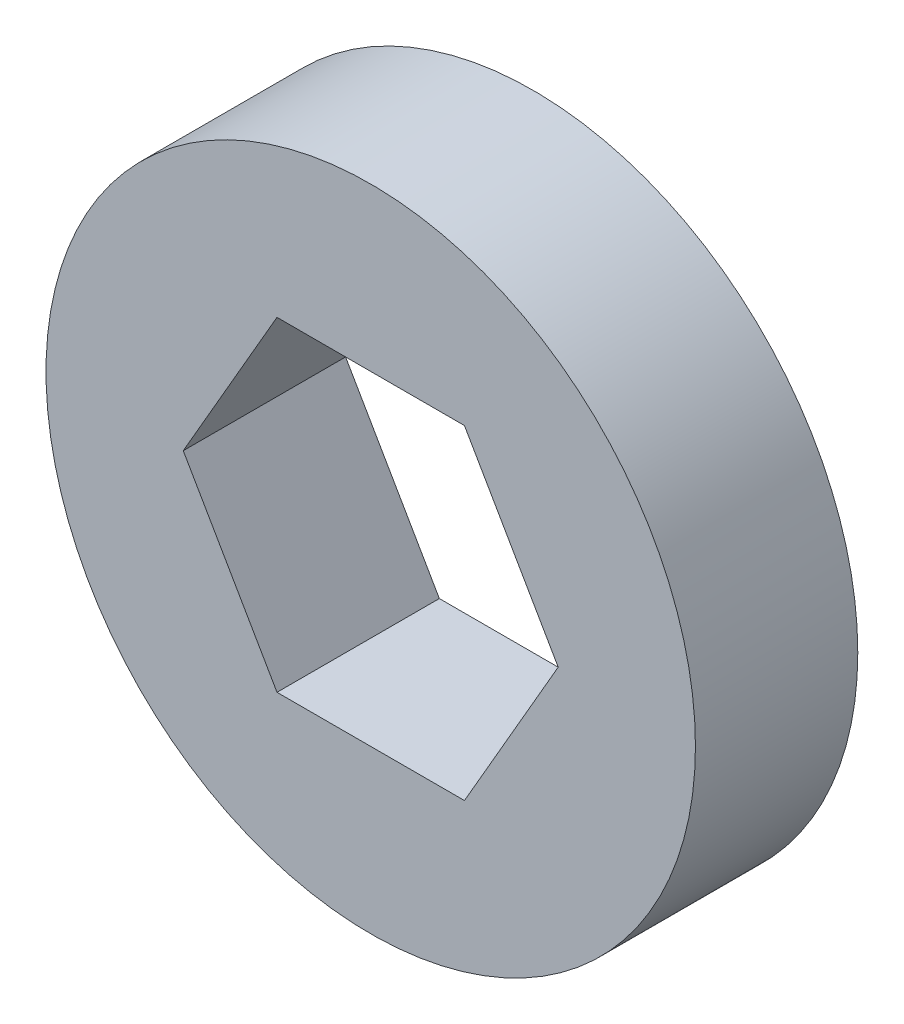
ISO-10303-21;
HEADER;
FILE_DESCRIPTION(('STEP AP214'),'2;1');
FILE_NAME('part.step','',(''),(''),'','','');
FILE_SCHEMA(('AUTOMOTIVE_DESIGN { 1 0 10303 214 1 1 1 1 }'));
ENDSEC;
DATA;
#1=APPLICATION_CONTEXT('core data for automotive mechanical design processes');
#2=APPLICATION_PROTOCOL_DEFINITION('international standard','automotive_design',2000,#1);
#3=PRODUCT_CONTEXT('',#1,'mechanical');
#4=PRODUCT('Part','Part','',(#3));
#5=PRODUCT_RELATED_PRODUCT_CATEGORY('part','',(#4));
#6=PRODUCT_DEFINITION_FORMATION('','',#4);
#7=PRODUCT_DEFINITION_CONTEXT('part definition',#1,'design');
#8=PRODUCT_DEFINITION('design','',#6,#7);
#9=PRODUCT_DEFINITION_SHAPE('','',#8);
#10=(LENGTH_UNIT() NAMED_UNIT(*) SI_UNIT(.MILLI.,.METRE.));
#11=(NAMED_UNIT(*) PLANE_ANGLE_UNIT() SI_UNIT($,.RADIAN.));
#12=(NAMED_UNIT(*) SI_UNIT($,.STERADIAN.) SOLID_ANGLE_UNIT());
#13=UNCERTAINTY_MEASURE_WITH_UNIT(LENGTH_MEASURE(1.E-05),#10,'distance_accuracy_value','');
#14=(GEOMETRIC_REPRESENTATION_CONTEXT(3) GLOBAL_UNCERTAINTY_ASSIGNED_CONTEXT((#13)) GLOBAL_UNIT_ASSIGNED_CONTEXT((#10,
#11,#12)) REPRESENTATION_CONTEXT('',''));
#15=CARTESIAN_POINT('',(0.,0.,0.));
#16=DIRECTION('',(0.,0.,1.));
#17=DIRECTION('',(1.,0.,0.));
#18=AXIS2_PLACEMENT_3D('',#15,#16,#17);
#19=CARTESIAN_POINT('',(0.,0.,6.35));
#20=DIRECTION('',(0.,0.,1.));
#21=DIRECTION('',(1.,0.,0.));
#22=AXIS2_PLACEMENT_3D('',#19,#20,#21);
#23=PLANE('',#22);
#24=CARTESIAN_POINT('',(0.,0.,6.35));
#25=DIRECTION('',(0.,0.,1.));
#26=DIRECTION('',(1.,0.,0.));
#27=AXIS2_PLACEMENT_3D('',#24,#25,#26);
#28=CIRCLE('',#27,12.7);
#29=CARTESIAN_POINT('',(12.7,0.,6.35));
#30=VERTEX_POINT('',#29);
#31=EDGE_CURVE('E11',#30,#30,#28,.T.);
#32=ORIENTED_EDGE('',*,*,#31,.T.);
#33=EDGE_LOOP('',(#32));
#34=FACE_BOUND('',#33,.T.);
#35=DIRECTION('',(-0.500000000000001,0.866025403784438,0.));
#36=VECTOR('',#35,1.);
#37=CARTESIAN_POINT('',(7.33234841870821,0.,6.35));
#38=LINE('',#37,#36);
#39=CARTESIAN_POINT('',(7.33234841870821,0.,6.35));
#40=VERTEX_POINT('',#39);
#41=CARTESIAN_POINT('',(3.66617420935409,6.34999999999998,6.35));
#42=VERTEX_POINT('',#41);
#43=EDGE_CURVE('E108',#40,#42,#38,.T.);
#44=ORIENTED_EDGE('',*,*,#43,.F.);
#45=DIRECTION('',(0.499999999999995,0.866025403784441,0.));
#46=VECTOR('',#45,1.);
#47=CARTESIAN_POINT('',(3.66617420935418,-6.34999999999993,6.35));
#48=LINE('',#47,#46);
#49=CARTESIAN_POINT('',(3.66617420935418,-6.34999999999993,6.35));
#50=VERTEX_POINT('',#49);
#51=EDGE_CURVE('E99',#50,#40,#48,.T.);
#52=ORIENTED_EDGE('',*,*,#51,.F.);
#53=DIRECTION('',(1.,0.,0.));
#54=VECTOR('',#53,1.);
#55=CARTESIAN_POINT('',(-3.66617420935405,-6.35,6.35));
#56=LINE('',#55,#54);
#57=CARTESIAN_POINT('',(-3.66617420935405,-6.35,6.35));
#58=VERTEX_POINT('',#57);
#59=EDGE_CURVE('E133',#58,#50,#56,.T.);
#60=ORIENTED_EDGE('',*,*,#59,.F.);
#61=DIRECTION('',(0.500000000000007,-0.866025403784435,0.));
#62=VECTOR('',#61,1.);
#63=CARTESIAN_POINT('',(-7.33234841870821,0.,6.35));
#64=LINE('',#63,#62);
#65=CARTESIAN_POINT('',(-7.33234841870821,0.,6.35));
#66=VERTEX_POINT('',#65);
#67=EDGE_CURVE('E130',#66,#58,#64,.T.);
#68=ORIENTED_EDGE('',*,*,#67,.F.);
#69=DIRECTION('',(-0.499999999999995,-0.866025403784442,0.));
#70=VECTOR('',#69,1.);
#71=CARTESIAN_POINT('',(-3.66617420935414,6.34999999999995,6.35));
#72=LINE('',#71,#70);
#73=CARTESIAN_POINT('',(-3.66617420935414,6.34999999999995,6.35));
#74=VERTEX_POINT('',#73);
#75=EDGE_CURVE('E125',#74,#66,#72,.T.);
#76=ORIENTED_EDGE('',*,*,#75,.F.);
#77=DIRECTION('',(-1.,0.,0.));
#78=VECTOR('',#77,1.);
#79=CARTESIAN_POINT('',(3.66617420935409,6.34999999999998,6.35));
#80=LINE('',#79,#78);
#81=EDGE_CURVE('E121',#42,#74,#80,.T.);
#82=ORIENTED_EDGE('',*,*,#81,.F.);
#83=EDGE_LOOP('',(#44,#52,#60,#68,#76,#82));
#84=FACE_BOUND('',#83,.T.);
#85=ADVANCED_FACE('F45',(#34,#84),#23,.T.);
#86=CARTESIAN_POINT('',(0.,0.,0.));
#87=DIRECTION('',(0.,0.,1.));
#88=DIRECTION('',(1.,0.,0.));
#89=AXIS2_PLACEMENT_3D('',#86,#87,#88);
#90=PLANE('',#89);
#91=CARTESIAN_POINT('',(0.,0.,0.));
#92=DIRECTION('',(0.,0.,1.));
#93=DIRECTION('',(1.,0.,0.));
#94=AXIS2_PLACEMENT_3D('',#91,#92,#93);
#95=CIRCLE('',#94,12.7);
#96=CARTESIAN_POINT('',(12.7,0.,0.));
#97=VERTEX_POINT('',#96);
#98=EDGE_CURVE('E49',#97,#97,#95,.T.);
#99=ORIENTED_EDGE('',*,*,#98,.F.);
#100=EDGE_LOOP('',(#99));
#101=FACE_BOUND('',#100,.T.);
#102=DIRECTION('',(0.499999999999995,0.866025403784441,0.));
#103=VECTOR('',#102,1.);
#104=CARTESIAN_POINT('',(3.66617420935418,-6.34999999999993,0.));
#105=LINE('',#104,#103);
#106=CARTESIAN_POINT('',(3.66617420935418,-6.34999999999993,0.));
#107=VERTEX_POINT('',#106);
#108=CARTESIAN_POINT('',(7.33234841870821,0.,0.));
#109=VERTEX_POINT('',#108);
#110=EDGE_CURVE('E69',#107,#109,#105,.T.);
#111=ORIENTED_EDGE('',*,*,#110,.T.);
#112=DIRECTION('',(-0.500000000000001,0.866025403784438,0.));
#113=VECTOR('',#112,1.);
#114=CARTESIAN_POINT('',(7.33234841870821,0.,0.));
#115=LINE('',#114,#113);
#116=CARTESIAN_POINT('',(3.66617420935409,6.34999999999998,0.));
#117=VERTEX_POINT('',#116);
#118=EDGE_CURVE('E115',#109,#117,#115,.T.);
#119=ORIENTED_EDGE('',*,*,#118,.T.);
#120=DIRECTION('',(-1.,0.,0.));
#121=VECTOR('',#120,1.);
#122=CARTESIAN_POINT('',(3.66617420935409,6.34999999999998,0.));
#123=LINE('',#122,#121);
#124=CARTESIAN_POINT('',(-3.66617420935414,6.34999999999995,0.));
#125=VERTEX_POINT('',#124);
#126=EDGE_CURVE('E140',#117,#125,#123,.T.);
#127=ORIENTED_EDGE('',*,*,#126,.T.);
#128=DIRECTION('',(-0.499999999999995,-0.866025403784442,0.));
#129=VECTOR('',#128,1.);
#130=CARTESIAN_POINT('',(-3.66617420935414,6.34999999999995,0.));
#131=LINE('',#130,#129);
#132=CARTESIAN_POINT('',(-7.33234841870821,0.,0.));
#133=VERTEX_POINT('',#132);
#134=EDGE_CURVE('E144',#125,#133,#131,.T.);
#135=ORIENTED_EDGE('',*,*,#134,.T.);
#136=DIRECTION('',(0.500000000000007,-0.866025403784435,0.));
#137=VECTOR('',#136,1.);
#138=CARTESIAN_POINT('',(-7.33234841870821,0.,0.));
#139=LINE('',#138,#137);
#140=CARTESIAN_POINT('',(-3.66617420935405,-6.35,0.));
#141=VERTEX_POINT('',#140);
#142=EDGE_CURVE('E148',#133,#141,#139,.T.);
#143=ORIENTED_EDGE('',*,*,#142,.T.);
#144=DIRECTION('',(1.,0.,0.));
#145=VECTOR('',#144,1.);
#146=CARTESIAN_POINT('',(-3.66617420935405,-6.35,0.));
#147=LINE('',#146,#145);
#148=EDGE_CURVE('E109',#141,#107,#147,.T.);
#149=ORIENTED_EDGE('',*,*,#148,.T.);
#150=EDGE_LOOP('',(#111,#119,#127,#135,#143,#149));
#151=FACE_BOUND('',#150,.T.);
#152=ADVANCED_FACE('F172',(#101,#151),#90,.F.);
#153=CARTESIAN_POINT('',(0.,0.,6.35));
#154=DIRECTION('',(0.,0.,-1.));
#155=DIRECTION('',(-1.,0.,0.));
#156=AXIS2_PLACEMENT_3D('',#153,#154,#155);
#157=CYLINDRICAL_SURFACE('',#156,12.7);
#158=ORIENTED_EDGE('',*,*,#31,.F.);
#159=EDGE_LOOP('',(#158));
#160=FACE_BOUND('',#159,.T.);
#161=ORIENTED_EDGE('',*,*,#98,.T.);
#162=EDGE_LOOP('',(#161));
#163=FACE_BOUND('',#162,.T.);
#164=ADVANCED_FACE('F47',(#160,#163),#157,.T.);
#165=CARTESIAN_POINT('',(3.66617420935418,-6.34999999999993,6.35));
#166=DIRECTION('',(-0.866025403784442,0.499999999999995,0.));
#167=DIRECTION('',(-0.499999999999995,-0.866025403784442,0.));
#168=AXIS2_PLACEMENT_3D('',#165,#166,#167);
#169=PLANE('',#168);
#170=ORIENTED_EDGE('',*,*,#110,.F.);
#171=DIRECTION('',(0.,0.,-1.));
#172=VECTOR('',#171,1.);
#173=CARTESIAN_POINT('',(3.66617420935418,-6.34999999999993,6.35));
#174=LINE('',#173,#172);
#175=EDGE_CURVE('E103',#50,#107,#174,.T.);
#176=ORIENTED_EDGE('',*,*,#175,.F.);
#177=ORIENTED_EDGE('',*,*,#51,.T.);
#178=DIRECTION('',(0.,0.,-1.));
#179=VECTOR('',#178,1.);
#180=CARTESIAN_POINT('',(7.33234841870821,0.,6.35));
#181=LINE('',#180,#179);
#182=EDGE_CURVE('E102',#40,#109,#181,.T.);
#183=ORIENTED_EDGE('',*,*,#182,.T.);
#184=EDGE_LOOP('',(#170,#176,#177,#183));
#185=FACE_BOUND('',#184,.T.);
#186=ADVANCED_FACE('F101',(#185),#169,.T.);
#187=CARTESIAN_POINT('',(7.33234841870821,0.,6.35));
#188=DIRECTION('',(-0.866025403784438,-0.500000000000001,0.));
#189=DIRECTION('',(0.500000000000001,-0.866025403784438,0.));
#190=AXIS2_PLACEMENT_3D('',#187,#188,#189);
#191=PLANE('',#190);
#192=ORIENTED_EDGE('',*,*,#118,.F.);
#193=ORIENTED_EDGE('',*,*,#182,.F.);
#194=ORIENTED_EDGE('',*,*,#43,.T.);
#195=DIRECTION('',(0.,0.,-1.));
#196=VECTOR('',#195,1.);
#197=CARTESIAN_POINT('',(3.66617420935409,6.34999999999998,6.35));
#198=LINE('',#197,#196);
#199=EDGE_CURVE('E117',#42,#117,#198,.T.);
#200=ORIENTED_EDGE('',*,*,#199,.T.);
#201=EDGE_LOOP('',(#192,#193,#194,#200));
#202=FACE_BOUND('',#201,.T.);
#203=ADVANCED_FACE('F112',(#202),#191,.T.);
#204=CARTESIAN_POINT('',(3.66617420935409,6.34999999999998,6.35));
#205=DIRECTION('',(0.,-1.,0.));
#206=DIRECTION('',(1.,0.,0.));
#207=AXIS2_PLACEMENT_3D('',#204,#205,#206);
#208=PLANE('',#207);
#209=ORIENTED_EDGE('',*,*,#126,.F.);
#210=ORIENTED_EDGE('',*,*,#199,.F.);
#211=ORIENTED_EDGE('',*,*,#81,.T.);
#212=DIRECTION('',(0.,0.,-1.));
#213=VECTOR('',#212,1.);
#214=CARTESIAN_POINT('',(-3.66617420935414,6.34999999999995,6.35));
#215=LINE('',#214,#213);
#216=EDGE_CURVE('E162',#74,#125,#215,.T.);
#217=ORIENTED_EDGE('',*,*,#216,.T.);
#218=EDGE_LOOP('',(#209,#210,#211,#217));
#219=FACE_BOUND('',#218,.T.);
#220=ADVANCED_FACE('F168',(#219),#208,.T.);
#221=CARTESIAN_POINT('',(-3.66617420935414,6.34999999999995,6.35));
#222=DIRECTION('',(0.866025403784442,-0.499999999999995,0.));
#223=DIRECTION('',(0.499999999999995,0.866025403784442,0.));
#224=AXIS2_PLACEMENT_3D('',#221,#222,#223);
#225=PLANE('',#224);
#226=ORIENTED_EDGE('',*,*,#134,.F.);
#227=ORIENTED_EDGE('',*,*,#216,.F.);
#228=ORIENTED_EDGE('',*,*,#75,.T.);
#229=DIRECTION('',(0.,0.,-1.));
#230=VECTOR('',#229,1.);
#231=CARTESIAN_POINT('',(-7.33234841870821,0.,6.35));
#232=LINE('',#231,#230);
#233=EDGE_CURVE('E159',#66,#133,#232,.T.);
#234=ORIENTED_EDGE('',*,*,#233,.T.);
#235=EDGE_LOOP('',(#226,#227,#228,#234));
#236=FACE_BOUND('',#235,.T.);
#237=ADVANCED_FACE('F180',(#236),#225,.T.);
#238=CARTESIAN_POINT('',(-7.33234841870821,0.,6.35));
#239=DIRECTION('',(0.866025403784435,0.500000000000007,0.));
#240=DIRECTION('',(-0.500000000000007,0.866025403784435,0.));
#241=AXIS2_PLACEMENT_3D('',#238,#239,#240);
#242=PLANE('',#241);
#243=ORIENTED_EDGE('',*,*,#142,.F.);
#244=ORIENTED_EDGE('',*,*,#233,.F.);
#245=ORIENTED_EDGE('',*,*,#67,.T.);
#246=DIRECTION('',(0.,0.,-1.));
#247=VECTOR('',#246,1.);
#248=CARTESIAN_POINT('',(-3.66617420935405,-6.35,6.35));
#249=LINE('',#248,#247);
#250=EDGE_CURVE('E61',#58,#141,#249,.T.);
#251=ORIENTED_EDGE('',*,*,#250,.T.);
#252=EDGE_LOOP('',(#243,#244,#245,#251));
#253=FACE_BOUND('',#252,.T.);
#254=ADVANCED_FACE('F178',(#253),#242,.T.);
#255=CARTESIAN_POINT('',(-3.66617420935405,-6.35,6.35));
#256=DIRECTION('',(0.,1.,0.));
#257=DIRECTION('',(-1.,0.,0.));
#258=AXIS2_PLACEMENT_3D('',#255,#256,#257);
#259=PLANE('',#258);
#260=ORIENTED_EDGE('',*,*,#148,.F.);
#261=ORIENTED_EDGE('',*,*,#250,.F.);
#262=ORIENTED_EDGE('',*,*,#59,.T.);
#263=ORIENTED_EDGE('',*,*,#175,.T.);
#264=EDGE_LOOP('',(#260,#261,#262,#263));
#265=FACE_BOUND('',#264,.T.);
#266=ADVANCED_FACE('F174',(#265),#259,.T.);
#267=CLOSED_SHELL('',(#85,#152,#164,#186,#203,#220,#237,#254,#266));
#268=MANIFOLD_SOLID_BREP('B2',#267);
#269=ADVANCED_BREP_SHAPE_REPRESENTATION('',(#18,#268),#14);
#270=SHAPE_DEFINITION_REPRESENTATION(#9,#269);
ENDSEC;
END-ISO-10303-21;
